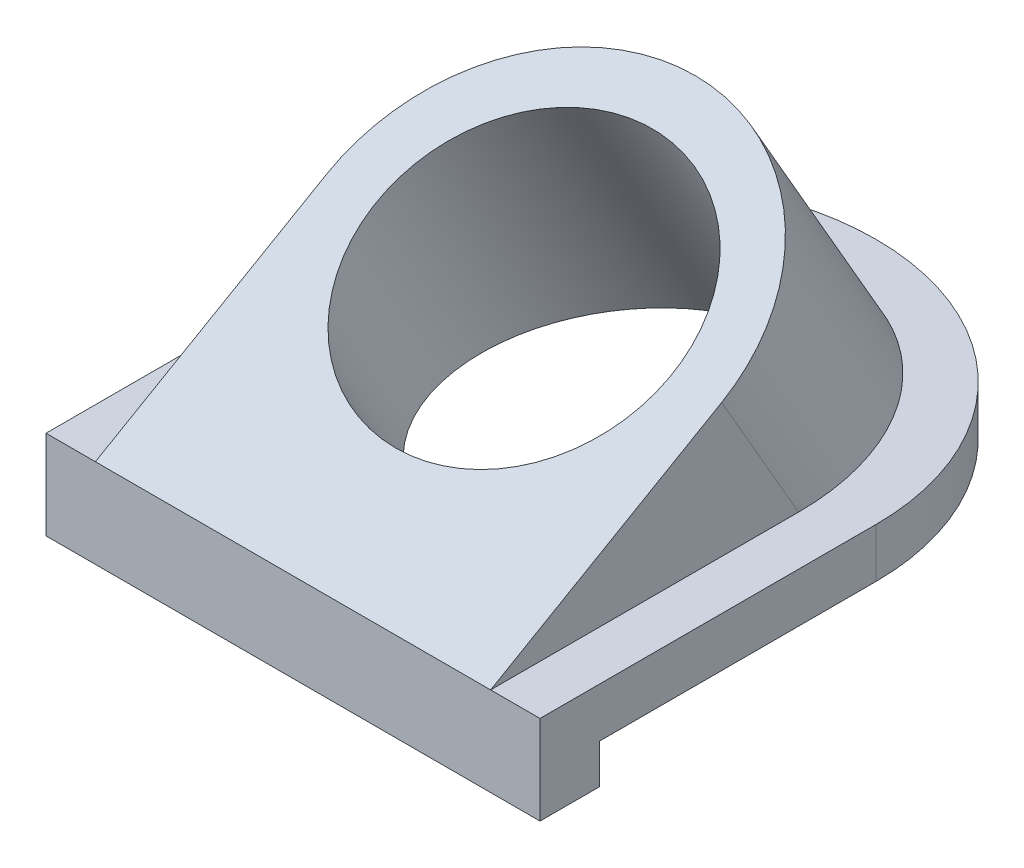
ISO-10303-21;
HEADER;
FILE_DESCRIPTION(('STEP AP214'),'2;1');
FILE_NAME('part.step','',(''),(''),'','','');
FILE_SCHEMA(('AUTOMOTIVE_DESIGN { 1 0 10303 214 1 1 1 1 }'));
ENDSEC;
DATA;
#1=APPLICATION_CONTEXT('core data for automotive mechanical design processes');
#2=APPLICATION_PROTOCOL_DEFINITION('international standard','automotive_design',2000,#1);
#3=PRODUCT_CONTEXT('',#1,'mechanical');
#4=PRODUCT('Part','Part','',(#3));
#5=PRODUCT_RELATED_PRODUCT_CATEGORY('part','',(#4));
#6=PRODUCT_DEFINITION_FORMATION('','',#4);
#7=PRODUCT_DEFINITION_CONTEXT('part definition',#1,'design');
#8=PRODUCT_DEFINITION('design','',#6,#7);
#9=PRODUCT_DEFINITION_SHAPE('','',#8);
#10=(LENGTH_UNIT() NAMED_UNIT(*) SI_UNIT(.MILLI.,.METRE.));
#11=(NAMED_UNIT(*) PLANE_ANGLE_UNIT() SI_UNIT($,.RADIAN.));
#12=(NAMED_UNIT(*) SI_UNIT($,.STERADIAN.) SOLID_ANGLE_UNIT());
#13=UNCERTAINTY_MEASURE_WITH_UNIT(LENGTH_MEASURE(1.E-05),#10,'distance_accuracy_value','');
#14=(GEOMETRIC_REPRESENTATION_CONTEXT(3) GLOBAL_UNCERTAINTY_ASSIGNED_CONTEXT((#13)) GLOBAL_UNIT_ASSIGNED_CONTEXT((#10,
#11,#12)) REPRESENTATION_CONTEXT('',''));
#15=CARTESIAN_POINT('',(0.,0.,0.));
#16=DIRECTION('',(0.,0.,1.));
#17=DIRECTION('',(1.,0.,0.));
#18=AXIS2_PLACEMENT_3D('',#15,#16,#17);
#19=CARTESIAN_POINT('',(0.,-18.,-68.));
#20=DIRECTION('',(0.,1.,0.));
#21=DIRECTION('',(0.,0.,1.));
#22=AXIS2_PLACEMENT_3D('',#19,#20,#21);
#23=CYLINDRICAL_SURFACE('',#22,50.);
#24=CARTESIAN_POINT('',(0.,-10.,-68.));
#25=DIRECTION('',(0.,-1.,0.));
#26=DIRECTION('',(0.,0.,-1.));
#27=AXIS2_PLACEMENT_3D('',#24,#25,#26);
#28=CIRCLE('',#27,50.);
#29=CARTESIAN_POINT('',(50.,-10.,-68.));
#30=VERTEX_POINT('',#29);
#31=CARTESIAN_POINT('',(-50.,-10.,-68.));
#32=VERTEX_POINT('',#31);
#33=EDGE_CURVE('E148',#30,#32,#28,.F.);
#34=ORIENTED_EDGE('',*,*,#33,.T.);
#35=DIRECTION('',(0.,1.,0.));
#36=VECTOR('',#35,1.);
#37=CARTESIAN_POINT('',(-50.,-18.,-68.));
#38=LINE('',#37,#36);
#39=CARTESIAN_POINT('',(-50.,0.,-68.));
#40=VERTEX_POINT('',#39);
#41=EDGE_CURVE('E11',#32,#40,#38,.T.);
#42=ORIENTED_EDGE('',*,*,#41,.T.);
#43=CARTESIAN_POINT('',(0.,0.,-68.));
#44=DIRECTION('',(0.,1.,0.));
#45=DIRECTION('',(0.,0.,1.));
#46=AXIS2_PLACEMENT_3D('',#43,#44,#45);
#47=CIRCLE('',#46,50.);
#48=CARTESIAN_POINT('',(50.,0.,-68.));
#49=VERTEX_POINT('',#48);
#50=EDGE_CURVE('E155',#49,#40,#47,.T.);
#51=ORIENTED_EDGE('',*,*,#50,.F.);
#52=DIRECTION('',(0.,1.,0.));
#53=VECTOR('',#52,1.);
#54=CARTESIAN_POINT('',(50.,-18.,-68.));
#55=LINE('',#54,#53);
#56=EDGE_CURVE('E42',#30,#49,#55,.T.);
#57=ORIENTED_EDGE('',*,*,#56,.F.);
#58=EDGE_LOOP('',(#34,#42,#51,#57));
#59=FACE_BOUND('',#58,.T.);
#60=ADVANCED_FACE('F33',(#59),#23,.T.);
#61=CARTESIAN_POINT('',(-50.,-18.,0.));
#62=DIRECTION('',(-1.,0.,0.));
#63=DIRECTION('',(0.,0.,1.));
#64=AXIS2_PLACEMENT_3D('',#61,#62,#63);
#65=PLANE('',#64);
#66=DIRECTION('',(0.,-1.,0.));
#67=VECTOR('',#66,1.);
#68=CARTESIAN_POINT('',(-50.,-10.,-12.));
#69=LINE('',#68,#67);
#70=CARTESIAN_POINT('',(-50.,-10.,-12.));
#71=VERTEX_POINT('',#70);
#72=CARTESIAN_POINT('',(-50.,-18.,-12.));
#73=VERTEX_POINT('',#72);
#74=EDGE_CURVE('E145',#71,#73,#69,.T.);
#75=ORIENTED_EDGE('',*,*,#74,.T.);
#76=DIRECTION('',(0.,0.,1.));
#77=VECTOR('',#76,1.);
#78=CARTESIAN_POINT('',(-50.,-18.,0.));
#79=LINE('',#78,#77);
#80=CARTESIAN_POINT('',(-50.,-18.,0.));
#81=VERTEX_POINT('',#80);
#82=EDGE_CURVE('E152',#73,#81,#79,.T.);
#83=ORIENTED_EDGE('',*,*,#82,.T.);
#84=DIRECTION('',(0.,1.,0.));
#85=VECTOR('',#84,1.);
#86=CARTESIAN_POINT('',(-50.,-18.,0.));
#87=LINE('',#86,#85);
#88=CARTESIAN_POINT('',(-50.,0.,0.));
#89=VERTEX_POINT('',#88);
#90=EDGE_CURVE('E37',#81,#89,#87,.T.);
#91=ORIENTED_EDGE('',*,*,#90,.T.);
#92=DIRECTION('',(0.,0.,1.));
#93=VECTOR('',#92,1.);
#94=CARTESIAN_POINT('',(-50.,0.,0.));
#95=LINE('',#94,#93);
#96=EDGE_CURVE('E151',#40,#89,#95,.T.);
#97=ORIENTED_EDGE('',*,*,#96,.F.);
#98=ORIENTED_EDGE('',*,*,#41,.F.);
#99=DIRECTION('',(0.,0.,-1.));
#100=VECTOR('',#99,1.);
#101=CARTESIAN_POINT('',(-50.,-10.,-12.));
#102=LINE('',#101,#100);
#103=EDGE_CURVE('E136',#71,#32,#102,.T.);
#104=ORIENTED_EDGE('',*,*,#103,.F.);
#105=EDGE_LOOP('',(#75,#83,#91,#97,#98,#104));
#106=FACE_BOUND('',#105,.T.);
#107=ADVANCED_FACE('F35',(#106),#65,.T.);
#108=CARTESIAN_POINT('',(50.,-18.,0.));
#109=DIRECTION('',(1.,0.,0.));
#110=DIRECTION('',(0.,0.,-1.));
#111=AXIS2_PLACEMENT_3D('',#108,#109,#110);
#112=PLANE('',#111);
#113=DIRECTION('',(0.,-1.,0.));
#114=VECTOR('',#113,1.);
#115=CARTESIAN_POINT('',(50.,-10.,-12.));
#116=LINE('',#115,#114);
#117=CARTESIAN_POINT('',(50.,-10.,-12.));
#118=VERTEX_POINT('',#117);
#119=CARTESIAN_POINT('',(50.,-18.,-12.));
#120=VERTEX_POINT('',#119);
#121=EDGE_CURVE('E143',#118,#120,#116,.T.);
#122=ORIENTED_EDGE('',*,*,#121,.F.);
#123=DIRECTION('',(0.,0.,1.));
#124=VECTOR('',#123,1.);
#125=CARTESIAN_POINT('',(50.,-10.,-12.));
#126=LINE('',#125,#124);
#127=EDGE_CURVE('E139',#30,#118,#126,.T.);
#128=ORIENTED_EDGE('',*,*,#127,.F.);
#129=ORIENTED_EDGE('',*,*,#56,.T.);
#130=DIRECTION('',(0.,0.,-1.));
#131=VECTOR('',#130,1.);
#132=CARTESIAN_POINT('',(50.,0.,0.));
#133=LINE('',#132,#131);
#134=CARTESIAN_POINT('',(50.,0.,0.));
#135=VERTEX_POINT('',#134);
#136=EDGE_CURVE('E166',#135,#49,#133,.T.);
#137=ORIENTED_EDGE('',*,*,#136,.F.);
#138=DIRECTION('',(0.,1.,0.));
#139=VECTOR('',#138,1.);
#140=CARTESIAN_POINT('',(50.,-18.,0.));
#141=LINE('',#140,#139);
#142=CARTESIAN_POINT('',(50.,-18.,0.));
#143=VERTEX_POINT('',#142);
#144=EDGE_CURVE('E171',#143,#135,#141,.T.);
#145=ORIENTED_EDGE('',*,*,#144,.F.);
#146=DIRECTION('',(0.,0.,-1.));
#147=VECTOR('',#146,1.);
#148=CARTESIAN_POINT('',(50.,-18.,0.));
#149=LINE('',#148,#147);
#150=EDGE_CURVE('E158',#143,#120,#149,.T.);
#151=ORIENTED_EDGE('',*,*,#150,.T.);
#152=EDGE_LOOP('',(#122,#128,#129,#137,#145,#151));
#153=FACE_BOUND('',#152,.T.);
#154=ADVANCED_FACE('F203',(#153),#112,.T.);
#155=CARTESIAN_POINT('',(-50.,-18.,0.));
#156=DIRECTION('',(0.,0.,1.));
#157=DIRECTION('',(1.,0.,0.));
#158=AXIS2_PLACEMENT_3D('',#155,#156,#157);
#159=PLANE('',#158);
#160=DIRECTION('',(1.,0.,0.));
#161=VECTOR('',#160,1.);
#162=CARTESIAN_POINT('',(-50.,0.,0.));
#163=LINE('',#162,#161);
#164=CARTESIAN_POINT('',(-40.,-2.74086309204336E-13,-1.59594559789866E-13));
#165=VERTEX_POINT('',#164);
#166=EDGE_CURVE('E164',#89,#165,#163,.T.);
#167=ORIENTED_EDGE('',*,*,#166,.F.);
#168=ORIENTED_EDGE('',*,*,#90,.F.);
#169=DIRECTION('',(1.,0.,0.));
#170=VECTOR('',#169,1.);
#171=CARTESIAN_POINT('',(-50.,-18.,0.));
#172=LINE('',#171,#170);
#173=EDGE_CURVE('E154',#81,#143,#172,.T.);
#174=ORIENTED_EDGE('',*,*,#173,.T.);
#175=ORIENTED_EDGE('',*,*,#144,.T.);
#176=CARTESIAN_POINT('',(40.,0.,0.));
#177=VERTEX_POINT('',#176);
#178=EDGE_CURVE('E163',#177,#135,#163,.T.);
#179=ORIENTED_EDGE('',*,*,#178,.F.);
#180=DIRECTION('',(1.,0.,0.));
#181=VECTOR('',#180,1.);
#182=CARTESIAN_POINT('',(-40.,-2.74086309204336E-13,-1.59594559789866E-13));
#183=LINE('',#182,#181);
#184=EDGE_CURVE('E117',#165,#177,#183,.T.);
#185=ORIENTED_EDGE('',*,*,#184,.F.);
#186=EDGE_LOOP('',(#167,#168,#174,#175,#179,#185));
#187=FACE_BOUND('',#186,.T.);
#188=ADVANCED_FACE('F184',(#187),#159,.T.);
#189=CARTESIAN_POINT('',(0.,-18.,-68.));
#190=DIRECTION('',(0.,1.,0.));
#191=DIRECTION('',(0.,0.,1.));
#192=AXIS2_PLACEMENT_3D('',#189,#190,#191);
#193=PLANE('',#192);
#194=ORIENTED_EDGE('',*,*,#82,.F.);
#195=DIRECTION('',(-1.,0.,0.));
#196=VECTOR('',#195,1.);
#197=CARTESIAN_POINT('',(-50.,-18.,-12.));
#198=LINE('',#197,#196);
#199=EDGE_CURVE('E135',#120,#73,#198,.T.);
#200=ORIENTED_EDGE('',*,*,#199,.F.);
#201=ORIENTED_EDGE('',*,*,#150,.F.);
#202=ORIENTED_EDGE('',*,*,#173,.F.);
#203=EDGE_LOOP('',(#194,#200,#201,#202));
#204=FACE_BOUND('',#203,.T.);
#205=ADVANCED_FACE('F201',(#204),#193,.F.);
#206=CARTESIAN_POINT('',(0.,0.,-68.));
#207=DIRECTION('',(0.,1.,0.));
#208=DIRECTION('',(0.,0.,1.));
#209=AXIS2_PLACEMENT_3D('',#206,#207,#208);
#210=PLANE('',#209);
#211=DIRECTION('',(0.,0.,-1.));
#212=VECTOR('',#211,1.);
#213=CARTESIAN_POINT('',(40.,0.,-68.));
#214=LINE('',#213,#212);
#215=CARTESIAN_POINT('',(40.,0.,-62.3538290724798));
#216=VERTEX_POINT('',#215);
#217=EDGE_CURVE('E133',#177,#216,#214,.T.);
#218=ORIENTED_EDGE('',*,*,#217,.F.);
#219=ORIENTED_EDGE('',*,*,#178,.T.);
#220=ORIENTED_EDGE('',*,*,#136,.T.);
#221=ORIENTED_EDGE('',*,*,#50,.T.);
#222=ORIENTED_EDGE('',*,*,#96,.T.);
#223=ORIENTED_EDGE('',*,*,#166,.T.);
#224=DIRECTION('',(0.,0.,1.));
#225=VECTOR('',#224,1.);
#226=CARTESIAN_POINT('',(-40.,0.,-68.));
#227=LINE('',#226,#225);
#228=CARTESIAN_POINT('',(-40.,0.,-62.3538290724798));
#229=VERTEX_POINT('',#228);
#230=EDGE_CURVE('E55',#229,#165,#227,.T.);
#231=ORIENTED_EDGE('',*,*,#230,.F.);
#232=CARTESIAN_POINT('',(0.,0.,-62.3538290724798));
#233=DIRECTION('',(0.,1.,0.));
#234=DIRECTION('',(0.,0.,1.));
#235=AXIS2_PLACEMENT_3D('',#232,#233,#234);
#236=ELLIPSE('',#235,46.1880215351702,40.);
#237=EDGE_CURVE('E50',#216,#229,#236,.T.);
#238=ORIENTED_EDGE('',*,*,#237,.F.);
#239=EDGE_LOOP('',(#218,#219,#220,#221,#222,#223,#231,#238));
#240=FACE_BOUND('',#239,.T.);
#241=ADVANCED_FACE('F185',(#240),#210,.T.);
#242=CARTESIAN_POINT('',(-50.,-10.,-12.));
#243=DIRECTION('',(0.,0.,1.));
#244=DIRECTION('',(1.,0.,0.));
#245=AXIS2_PLACEMENT_3D('',#242,#243,#244);
#246=PLANE('',#245);
#247=ORIENTED_EDGE('',*,*,#199,.T.);
#248=ORIENTED_EDGE('',*,*,#74,.F.);
#249=DIRECTION('',(-1.,0.,0.));
#250=VECTOR('',#249,1.);
#251=CARTESIAN_POINT('',(-50.,-10.,-12.));
#252=LINE('',#251,#250);
#253=EDGE_CURVE('E141',#118,#71,#252,.T.);
#254=ORIENTED_EDGE('',*,*,#253,.F.);
#255=ORIENTED_EDGE('',*,*,#121,.T.);
#256=EDGE_LOOP('',(#247,#248,#254,#255));
#257=FACE_BOUND('',#256,.T.);
#258=ADVANCED_FACE('F197',(#257),#246,.F.);
#259=CARTESIAN_POINT('',(0.,-10.,0.));
#260=DIRECTION('',(0.,-1.,0.));
#261=DIRECTION('',(0.,0.,-1.));
#262=AXIS2_PLACEMENT_3D('',#259,#260,#261);
#263=PLANE('',#262);
#264=CARTESIAN_POINT('',(0.,-9.99999999999999,-68.1273317643761));
#265=DIRECTION('',(0.,-1.,0.));
#266=DIRECTION('',(0.,0.,1.));
#267=AXIS2_PLACEMENT_3D('',#264,#265,#266);
#268=ELLIPSE('',#267,34.6410161513776,30.);
#269=CARTESIAN_POINT('',(0.,-9.99999999999999,-33.4863156129985));
#270=VERTEX_POINT('',#269);
#271=EDGE_CURVE('E118',#270,#270,#268,.F.);
#272=ORIENTED_EDGE('',*,*,#271,.T.);
#273=EDGE_LOOP('',(#272));
#274=FACE_BOUND('',#273,.T.);
#275=ORIENTED_EDGE('',*,*,#253,.T.);
#276=ORIENTED_EDGE('',*,*,#103,.T.);
#277=ORIENTED_EDGE('',*,*,#33,.F.);
#278=ORIENTED_EDGE('',*,*,#127,.T.);
#279=EDGE_LOOP('',(#275,#276,#277,#278));
#280=FACE_BOUND('',#279,.T.);
#281=ADVANCED_FACE('F192',(#274,#280),#263,.T.);
#282=CARTESIAN_POINT('',(0.,27.,-46.7653718043597));
#283=DIRECTION('',(0.,0.866025403784436,0.500000000000004));
#284=DIRECTION('',(0.,-0.500000000000005,0.866025403784436));
#285=AXIS2_PLACEMENT_3D('',#282,#283,#284);
#286=PLANE('',#285);
#287=CARTESIAN_POINT('',(0.,27.,-46.7653718043597));
#288=DIRECTION('',(0.,0.866025403784436,0.500000000000004));
#289=DIRECTION('',(0.,-0.500000000000005,0.866025403784436));
#290=AXIS2_PLACEMENT_3D('',#287,#288,#289);
#291=CIRCLE('',#290,30.);
#292=CARTESIAN_POINT('',(0.,11.9999999999998,-20.7846096908266));
#293=VERTEX_POINT('',#292);
#294=EDGE_CURVE('E243',#293,#293,#291,.T.);
#295=ORIENTED_EDGE('',*,*,#294,.F.);
#296=EDGE_LOOP('',(#295));
#297=FACE_BOUND('',#296,.T.);
#298=DIRECTION('',(0.,-0.500000000000004,0.866025403784436));
#299=VECTOR('',#298,1.);
#300=CARTESIAN_POINT('',(-40.,27.,-46.7653718043597));
#301=LINE('',#300,#299);
#302=CARTESIAN_POINT('',(-40.,27.,-46.7653718043597));
#303=VERTEX_POINT('',#302);
#304=EDGE_CURVE('E113',#303,#165,#301,.T.);
#305=ORIENTED_EDGE('',*,*,#304,.T.);
#306=ORIENTED_EDGE('',*,*,#184,.T.);
#307=DIRECTION('',(0.,0.500000000000004,-0.866025403784436));
#308=VECTOR('',#307,1.);
#309=CARTESIAN_POINT('',(40.,-2.74086309204336E-13,-1.59594559789866E-13));
#310=LINE('',#309,#308);
#311=CARTESIAN_POINT('',(40.,27.,-46.7653718043597));
#312=VERTEX_POINT('',#311);
#313=EDGE_CURVE('E123',#177,#312,#310,.T.);
#314=ORIENTED_EDGE('',*,*,#313,.T.);
#315=CARTESIAN_POINT('',(0.,27.,-46.7653718043597));
#316=DIRECTION('',(0.,0.866025403784436,0.500000000000004));
#317=DIRECTION('',(0.,-0.500000000000005,0.866025403784436));
#318=AXIS2_PLACEMENT_3D('',#315,#316,#317);
#319=CIRCLE('',#318,40.);
#320=EDGE_CURVE('E108',#312,#303,#319,.T.);
#321=ORIENTED_EDGE('',*,*,#320,.T.);
#322=EDGE_LOOP('',(#305,#306,#314,#321));
#323=FACE_BOUND('',#322,.T.);
#324=ADVANCED_FACE('F121',(#297,#323),#286,.T.);
#325=CARTESIAN_POINT('',(40.,-148.665669910915,-85.832164542324));
#326=DIRECTION('',(1.,0.,0.));
#327=DIRECTION('',(0.,0.,-1.));
#328=AXIS2_PLACEMENT_3D('',#325,#326,#327);
#329=PLANE('',#328);
#330=ORIENTED_EDGE('',*,*,#313,.F.);
#331=ORIENTED_EDGE('',*,*,#217,.T.);
#332=DIRECTION('',(0.,0.866025403784436,0.500000000000004));
#333=VECTOR('',#332,1.);
#334=CARTESIAN_POINT('',(40.,-121.665669910915,-132.597536346684));
#335=LINE('',#334,#333);
#336=EDGE_CURVE('E110',#216,#312,#335,.T.);
#337=ORIENTED_EDGE('',*,*,#336,.T.);
#338=EDGE_LOOP('',(#330,#331,#337));
#339=FACE_BOUND('',#338,.T.);
#340=ADVANCED_FACE('F224',(#339),#329,.T.);
#341=CARTESIAN_POINT('',(0.,-121.665669910915,-132.597536346684));
#342=DIRECTION('',(0.,0.866025403784436,0.500000000000004));
#343=DIRECTION('',(0.,-0.500000000000005,0.866025403784436));
#344=AXIS2_PLACEMENT_3D('',#341,#342,#343);
#345=CYLINDRICAL_SURFACE('',#344,40.);
#346=ORIENTED_EDGE('',*,*,#336,.F.);
#347=ORIENTED_EDGE('',*,*,#237,.T.);
#348=DIRECTION('',(0.,0.866025403784436,0.500000000000004));
#349=VECTOR('',#348,1.);
#350=CARTESIAN_POINT('',(-40.,-121.665669910915,-132.597536346684));
#351=LINE('',#350,#349);
#352=EDGE_CURVE('E103',#229,#303,#351,.T.);
#353=ORIENTED_EDGE('',*,*,#352,.T.);
#354=ORIENTED_EDGE('',*,*,#320,.F.);
#355=EDGE_LOOP('',(#346,#347,#353,#354));
#356=FACE_BOUND('',#355,.T.);
#357=ADVANCED_FACE('F106',(#356),#345,.T.);
#358=CARTESIAN_POINT('',(-40.,-121.665669910915,-132.597536346684));
#359=DIRECTION('',(-1.,0.,0.));
#360=DIRECTION('',(0.,0.,1.));
#361=AXIS2_PLACEMENT_3D('',#358,#359,#360);
#362=PLANE('',#361);
#363=ORIENTED_EDGE('',*,*,#352,.F.);
#364=ORIENTED_EDGE('',*,*,#230,.T.);
#365=ORIENTED_EDGE('',*,*,#304,.F.);
#366=EDGE_LOOP('',(#363,#364,#365));
#367=FACE_BOUND('',#366,.T.);
#368=ADVANCED_FACE('F114',(#367),#362,.T.);
#369=CARTESIAN_POINT('',(0.,-89.1687530129404,-113.835432627805));
#370=DIRECTION('',(0.,0.866025403784436,0.500000000000004));
#371=DIRECTION('',(0.,-0.500000000000005,0.866025403784436));
#372=AXIS2_PLACEMENT_3D('',#369,#370,#371);
#373=CYLINDRICAL_SURFACE('',#372,30.);
#374=ORIENTED_EDGE('',*,*,#294,.T.);
#375=EDGE_LOOP('',(#374));
#376=FACE_BOUND('',#375,.T.);
#377=ORIENTED_EDGE('',*,*,#271,.F.);
#378=EDGE_LOOP('',(#377));
#379=FACE_BOUND('',#378,.T.);
#380=ADVANCED_FACE('F232',(#376,#379),#373,.F.);
#381=CLOSED_SHELL('',(#60,#107,#154,#188,#205,#241,#258,#281,#324,#340,#357,#368,#380));
#382=MANIFOLD_SOLID_BREP('B2',#381);
#383=ADVANCED_BREP_SHAPE_REPRESENTATION('',(#18,#382),#14);
#384=SHAPE_DEFINITION_REPRESENTATION(#9,#383);
ENDSEC;
END-ISO-10303-21;
